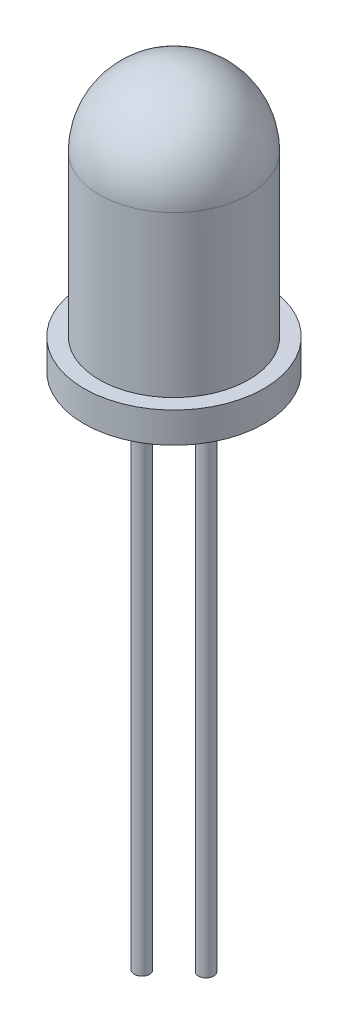
ISO-10303-21;
HEADER;
FILE_DESCRIPTION(('STEP AP214'),'2;1');
FILE_NAME('part.step','',(''),(''),'','','');
FILE_SCHEMA(('AUTOMOTIVE_DESIGN { 1 0 10303 214 1 1 1 1 }'));
ENDSEC;
DATA;
#1=APPLICATION_CONTEXT('core data for automotive mechanical design processes');
#2=APPLICATION_PROTOCOL_DEFINITION('international standard','automotive_design',2000,#1);
#3=PRODUCT_CONTEXT('',#1,'mechanical');
#4=PRODUCT('Part','Part','',(#3));
#5=PRODUCT_RELATED_PRODUCT_CATEGORY('part','',(#4));
#6=PRODUCT_DEFINITION_FORMATION('','',#4);
#7=PRODUCT_DEFINITION_CONTEXT('part definition',#1,'design');
#8=PRODUCT_DEFINITION('design','',#6,#7);
#9=PRODUCT_DEFINITION_SHAPE('','',#8);
#10=(LENGTH_UNIT() NAMED_UNIT(*) SI_UNIT(.MILLI.,.METRE.));
#11=(NAMED_UNIT(*) PLANE_ANGLE_UNIT() SI_UNIT($,.RADIAN.));
#12=(NAMED_UNIT(*) SI_UNIT($,.STERADIAN.) SOLID_ANGLE_UNIT());
#13=UNCERTAINTY_MEASURE_WITH_UNIT(LENGTH_MEASURE(1.E-05),#10,'distance_accuracy_value','');
#14=(GEOMETRIC_REPRESENTATION_CONTEXT(3) GLOBAL_UNCERTAINTY_ASSIGNED_CONTEXT((#13)) GLOBAL_UNIT_ASSIGNED_CONTEXT((#10,
#11,#12)) REPRESENTATION_CONTEXT('',''));
#15=CARTESIAN_POINT('',(0.,0.,0.));
#16=DIRECTION('',(0.,0.,1.));
#17=DIRECTION('',(1.,0.,0.));
#18=AXIS2_PLACEMENT_3D('',#15,#16,#17);
#19=CARTESIAN_POINT('',(1.05,2.5,0.));
#20=DIRECTION('',(0.,-1.,0.));
#21=DIRECTION('',(0.,0.,-1.));
#22=AXIS2_PLACEMENT_3D('',#19,#20,#21);
#23=CYLINDRICAL_SURFACE('',#22,0.25);
#24=CARTESIAN_POINT('',(1.05,0.5,0.));
#25=DIRECTION('',(0.,-1.,0.));
#26=DIRECTION('',(0.,0.,-1.));
#27=AXIS2_PLACEMENT_3D('',#24,#25,#26);
#28=CIRCLE('',#27,0.25);
#29=CARTESIAN_POINT('',(1.05,0.5,-0.25));
#30=VERTEX_POINT('',#29);
#31=EDGE_CURVE('E10',#30,#30,#28,.T.);
#32=ORIENTED_EDGE('',*,*,#31,.T.);
#33=EDGE_LOOP('',(#32));
#34=FACE_BOUND('',#33,.T.);
#35=CARTESIAN_POINT('',(1.05,-16.5,0.));
#36=DIRECTION('',(0.,-1.,0.));
#37=DIRECTION('',(0.,0.,-1.));
#38=AXIS2_PLACEMENT_3D('',#35,#36,#37);
#39=CIRCLE('',#38,0.25);
#40=CARTESIAN_POINT('',(1.05,-16.5,-0.25));
#41=VERTEX_POINT('',#40);
#42=EDGE_CURVE('E87',#41,#41,#39,.T.);
#43=ORIENTED_EDGE('',*,*,#42,.F.);
#44=EDGE_LOOP('',(#43));
#45=FACE_BOUND('',#44,.T.);
#46=ADVANCED_FACE('F43',(#34,#45),#23,.T.);
#47=CARTESIAN_POINT('',(0.,1.,0.));
#48=DIRECTION('',(0.,-1.,0.));
#49=DIRECTION('',(0.,0.,-1.));
#50=AXIS2_PLACEMENT_3D('',#47,#48,#49);
#51=CYLINDRICAL_SURFACE('',#50,2.95);
#52=CARTESIAN_POINT('',(0.,1.,0.));
#53=DIRECTION('',(0.,1.,0.));
#54=DIRECTION('',(0.,0.,1.));
#55=AXIS2_PLACEMENT_3D('',#52,#53,#54);
#56=CIRCLE('',#55,2.95);
#57=CARTESIAN_POINT('',(0.,1.,2.95));
#58=VERTEX_POINT('',#57);
#59=EDGE_CURVE('E56',#58,#58,#56,.T.);
#60=ORIENTED_EDGE('',*,*,#59,.F.);
#61=EDGE_LOOP('',(#60));
#62=FACE_BOUND('',#61,.T.);
#63=CARTESIAN_POINT('',(0.,0.,0.));
#64=DIRECTION('',(0.,1.,0.));
#65=DIRECTION('',(0.,0.,1.));
#66=AXIS2_PLACEMENT_3D('',#63,#64,#65);
#67=CIRCLE('',#66,2.95);
#68=CARTESIAN_POINT('',(0.,0.,2.95));
#69=VERTEX_POINT('',#68);
#70=EDGE_CURVE('E61',#69,#69,#67,.T.);
#71=ORIENTED_EDGE('',*,*,#70,.T.);
#72=EDGE_LOOP('',(#71));
#73=FACE_BOUND('',#72,.T.);
#74=ADVANCED_FACE('F45',(#62,#73),#51,.T.);
#75=CARTESIAN_POINT('',(0.,1.,0.));
#76=DIRECTION('',(0.,1.,0.));
#77=DIRECTION('',(0.,0.,1.));
#78=AXIS2_PLACEMENT_3D('',#75,#76,#77);
#79=PLANE('',#78);
#80=CARTESIAN_POINT('',(0.,1.,0.));
#81=DIRECTION('',(0.,-1.,0.));
#82=DIRECTION('',(0.,0.,-1.));
#83=AXIS2_PLACEMENT_3D('',#80,#81,#82);
#84=CIRCLE('',#83,2.45);
#85=CARTESIAN_POINT('',(0.,1.,-2.45));
#86=VERTEX_POINT('',#85);
#87=EDGE_CURVE('E71',#86,#86,#84,.T.);
#88=ORIENTED_EDGE('',*,*,#87,.T.);
#89=EDGE_LOOP('',(#88));
#90=FACE_BOUND('',#89,.T.);
#91=ORIENTED_EDGE('',*,*,#59,.T.);
#92=EDGE_LOOP('',(#91));
#93=FACE_BOUND('',#92,.T.);
#94=ADVANCED_FACE('F99',(#90,#93),#79,.T.);
#95=CARTESIAN_POINT('',(0.,0.,0.));
#96=DIRECTION('',(0.,1.,0.));
#97=DIRECTION('',(0.,0.,1.));
#98=AXIS2_PLACEMENT_3D('',#95,#96,#97);
#99=PLANE('',#98);
#100=CARTESIAN_POINT('',(0.,0.,0.));
#101=DIRECTION('',(0.,-1.,0.));
#102=DIRECTION('',(0.,0.,-1.));
#103=AXIS2_PLACEMENT_3D('',#100,#101,#102);
#104=CIRCLE('',#103,2.45);
#105=CARTESIAN_POINT('',(0.,0.,-2.45));
#106=VERTEX_POINT('',#105);
#107=EDGE_CURVE('E76',#106,#106,#104,.T.);
#108=ORIENTED_EDGE('',*,*,#107,.F.);
#109=EDGE_LOOP('',(#108));
#110=FACE_BOUND('',#109,.T.);
#111=ORIENTED_EDGE('',*,*,#70,.F.);
#112=EDGE_LOOP('',(#111));
#113=FACE_BOUND('',#112,.T.);
#114=ADVANCED_FACE('F125',(#110,#113),#99,.F.);
#115=CARTESIAN_POINT('',(0.,6.25,0.));
#116=DIRECTION('',(0.,-1.,0.));
#117=DIRECTION('',(-1.,0.,0.));
#118=AXIS2_PLACEMENT_3D('',#115,#116,#117);
#119=SPHERICAL_SURFACE('',#118,2.45);
#120=CARTESIAN_POINT('',(0.,6.25,0.));
#121=DIRECTION('',(0.,-1.,0.));
#122=DIRECTION('',(0.,0.,-1.));
#123=AXIS2_PLACEMENT_3D('',#120,#121,#122);
#124=CIRCLE('',#123,2.45);
#125=CARTESIAN_POINT('',(0.,6.25,-2.45));
#126=VERTEX_POINT('',#125);
#127=EDGE_CURVE('E66',#126,#126,#124,.T.);
#128=ORIENTED_EDGE('',*,*,#127,.F.);
#129=EDGE_LOOP('',(#128));
#130=FACE_BOUND('',#129,.T.);
#131=ADVANCED_FACE('F121',(#130),#119,.T.);
#132=CARTESIAN_POINT('',(0.,0.,0.));
#133=DIRECTION('',(0.,-1.,0.));
#134=DIRECTION('',(0.,0.,-1.));
#135=AXIS2_PLACEMENT_3D('',#132,#133,#134);
#136=CYLINDRICAL_SURFACE('',#135,2.45);
#137=ORIENTED_EDGE('',*,*,#87,.F.);
#138=EDGE_LOOP('',(#137));
#139=FACE_BOUND('',#138,.T.);
#140=ORIENTED_EDGE('',*,*,#127,.T.);
#141=EDGE_LOOP('',(#140));
#142=FACE_BOUND('',#141,.T.);
#143=ADVANCED_FACE('F117',(#139,#142),#136,.T.);
#144=CARTESIAN_POINT('',(0.,0.5,0.));
#145=DIRECTION('',(0.,-1.,0.));
#146=DIRECTION('',(0.,0.,-1.));
#147=AXIS2_PLACEMENT_3D('',#144,#145,#146);
#148=CYLINDRICAL_SURFACE('',#147,2.45);
#149=CARTESIAN_POINT('',(0.,0.5,0.));
#150=DIRECTION('',(0.,-1.,0.));
#151=DIRECTION('',(0.,0.,-1.));
#152=AXIS2_PLACEMENT_3D('',#149,#150,#151);
#153=CIRCLE('',#152,2.45);
#154=CARTESIAN_POINT('',(0.,0.5,-2.45));
#155=VERTEX_POINT('',#154);
#156=EDGE_CURVE('E75',#155,#155,#153,.T.);
#157=ORIENTED_EDGE('',*,*,#156,.F.);
#158=EDGE_LOOP('',(#157));
#159=FACE_BOUND('',#158,.T.);
#160=ORIENTED_EDGE('',*,*,#107,.T.);
#161=EDGE_LOOP('',(#160));
#162=FACE_BOUND('',#161,.T.);
#163=ADVANCED_FACE('F113',(#159,#162),#148,.F.);
#164=CARTESIAN_POINT('',(0.,0.5,0.));
#165=DIRECTION('',(0.,-1.,0.));
#166=DIRECTION('',(0.,0.,-1.));
#167=AXIS2_PLACEMENT_3D('',#164,#165,#166);
#168=PLANE('',#167);
#169=ORIENTED_EDGE('',*,*,#31,.F.);
#170=EDGE_LOOP('',(#169));
#171=FACE_BOUND('',#170,.T.);
#172=CARTESIAN_POINT('',(-1.05,0.5,0.));
#173=DIRECTION('',(0.,-1.,0.));
#174=DIRECTION('',(0.,0.,-1.));
#175=AXIS2_PLACEMENT_3D('',#172,#173,#174);
#176=CIRCLE('',#175,0.25);
#177=CARTESIAN_POINT('',(-1.05,0.5,-0.25));
#178=VERTEX_POINT('',#177);
#179=EDGE_CURVE('E51',#178,#178,#176,.T.);
#180=ORIENTED_EDGE('',*,*,#179,.F.);
#181=EDGE_LOOP('',(#180));
#182=FACE_BOUND('',#181,.T.);
#183=ORIENTED_EDGE('',*,*,#156,.T.);
#184=EDGE_LOOP('',(#183));
#185=FACE_BOUND('',#184,.T.);
#186=ADVANCED_FACE('F110',(#171,#182,#185),#168,.T.);
#187=CARTESIAN_POINT('',(-1.05,2.5,0.));
#188=DIRECTION('',(0.,-1.,0.));
#189=DIRECTION('',(0.,0.,-1.));
#190=AXIS2_PLACEMENT_3D('',#187,#188,#189);
#191=CYLINDRICAL_SURFACE('',#190,0.25);
#192=ORIENTED_EDGE('',*,*,#179,.T.);
#193=EDGE_LOOP('',(#192));
#194=FACE_BOUND('',#193,.T.);
#195=CARTESIAN_POINT('',(-1.05,-17.5,0.));
#196=DIRECTION('',(0.,-1.,0.));
#197=DIRECTION('',(0.,0.,-1.));
#198=AXIS2_PLACEMENT_3D('',#195,#196,#197);
#199=CIRCLE('',#198,0.25);
#200=CARTESIAN_POINT('',(-1.05,-17.5,-0.25));
#201=VERTEX_POINT('',#200);
#202=EDGE_CURVE('E80',#201,#201,#199,.T.);
#203=ORIENTED_EDGE('',*,*,#202,.F.);
#204=EDGE_LOOP('',(#203));
#205=FACE_BOUND('',#204,.T.);
#206=ADVANCED_FACE('F106',(#194,#205),#191,.T.);
#207=CARTESIAN_POINT('',(-1.05,-17.5,0.));
#208=DIRECTION('',(0.,-1.,0.));
#209=DIRECTION('',(0.,0.,-1.));
#210=AXIS2_PLACEMENT_3D('',#207,#208,#209);
#211=PLANE('',#210);
#212=ORIENTED_EDGE('',*,*,#202,.T.);
#213=EDGE_LOOP('',(#212));
#214=FACE_BOUND('',#213,.T.);
#215=ADVANCED_FACE('F103',(#214),#211,.T.);
#216=CARTESIAN_POINT('',(1.05,-16.5,0.));
#217=DIRECTION('',(0.,-1.,0.));
#218=DIRECTION('',(0.,0.,-1.));
#219=AXIS2_PLACEMENT_3D('',#216,#217,#218);
#220=PLANE('',#219);
#221=ORIENTED_EDGE('',*,*,#42,.T.);
#222=EDGE_LOOP('',(#221));
#223=FACE_BOUND('',#222,.T.);
#224=ADVANCED_FACE('F92',(#223),#220,.T.);
#225=CLOSED_SHELL('',(#46,#74,#94,#114,#131,#143,#163,#186,#206,#215,#224));
#226=MANIFOLD_SOLID_BREP('B2',#225);
#227=ADVANCED_BREP_SHAPE_REPRESENTATION('',(#18,#226),#14);
#228=SHAPE_DEFINITION_REPRESENTATION(#9,#227);
ENDSEC;
END-ISO-10303-21;
